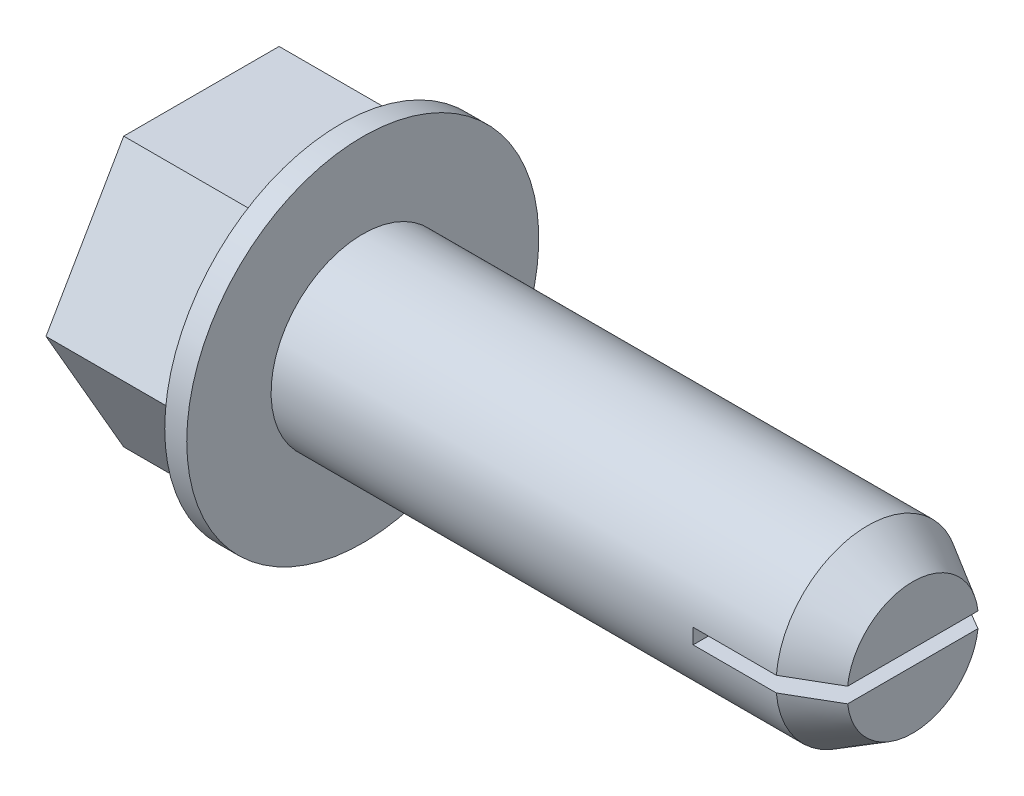
ISO-10303-21;
HEADER;
FILE_DESCRIPTION(('STEP AP214'),'2;1');
FILE_NAME('part.step','',(''),(''),'','','');
FILE_SCHEMA(('AUTOMOTIVE_DESIGN { 1 0 10303 214 1 1 1 1 }'));
ENDSEC;
DATA;
#1=APPLICATION_CONTEXT('core data for automotive mechanical design processes');
#2=APPLICATION_PROTOCOL_DEFINITION('international standard','automotive_design',2000,#1);
#3=PRODUCT_CONTEXT('',#1,'mechanical');
#4=PRODUCT('Part','Part','',(#3));
#5=PRODUCT_RELATED_PRODUCT_CATEGORY('part','',(#4));
#6=PRODUCT_DEFINITION_FORMATION('','',#4);
#7=PRODUCT_DEFINITION_CONTEXT('part definition',#1,'design');
#8=PRODUCT_DEFINITION('design','',#6,#7);
#9=PRODUCT_DEFINITION_SHAPE('','',#8);
#10=(LENGTH_UNIT() NAMED_UNIT(*) SI_UNIT(.MILLI.,.METRE.));
#11=(NAMED_UNIT(*) PLANE_ANGLE_UNIT() SI_UNIT($,.RADIAN.));
#12=(NAMED_UNIT(*) SI_UNIT($,.STERADIAN.) SOLID_ANGLE_UNIT());
#13=UNCERTAINTY_MEASURE_WITH_UNIT(LENGTH_MEASURE(1.E-05),#10,'distance_accuracy_value','');
#14=(GEOMETRIC_REPRESENTATION_CONTEXT(3) GLOBAL_UNCERTAINTY_ASSIGNED_CONTEXT((#13)) GLOBAL_UNIT_ASSIGNED_CONTEXT((#10,
#11,#12)) REPRESENTATION_CONTEXT('',''));
#15=CARTESIAN_POINT('',(0.,0.,0.));
#16=DIRECTION('',(0.,0.,1.));
#17=DIRECTION('',(1.,0.,0.));
#18=AXIS2_PLACEMENT_3D('',#15,#16,#17);
#19=CARTESIAN_POINT('',(-0.762,0.,0.));
#20=DIRECTION('',(1.,0.,0.));
#21=DIRECTION('',(0.,0.,-1.));
#22=AXIS2_PLACEMENT_3D('',#19,#20,#21);
#23=PLANE('',#22);
#24=CARTESIAN_POINT('',(-0.762,0.,0.));
#25=DIRECTION('',(-1.,0.,0.));
#26=DIRECTION('',(0.,0.,-1.));
#27=AXIS2_PLACEMENT_3D('',#24,#25,#26);
#28=CIRCLE('',#27,6.096);
#29=CARTESIAN_POINT('',(-0.762,0.,6.096));
#30=VERTEX_POINT('',#29);
#31=EDGE_CURVE('E184',#30,#30,#28,.T.);
#32=ORIENTED_EDGE('',*,*,#31,.T.);
#33=EDGE_LOOP('',(#32));
#34=FACE_BOUND('',#33,.T.);
#35=DIRECTION('',(0.,0.,1.));
#36=VECTOR('',#35,1.);
#37=CARTESIAN_POINT('',(-0.762,-4.6609,2.69097186966593));
#38=LINE('',#37,#36);
#39=CARTESIAN_POINT('',(-0.762,-4.6609,-2.69097186966593));
#40=VERTEX_POINT('',#39);
#41=CARTESIAN_POINT('',(-0.762,-4.6609,2.69097186966593));
#42=VERTEX_POINT('',#41);
#43=EDGE_CURVE('E151',#40,#42,#38,.T.);
#44=ORIENTED_EDGE('',*,*,#43,.F.);
#45=DIRECTION('',(0.,-0.866025403784439,0.5));
#46=VECTOR('',#45,1.);
#47=CARTESIAN_POINT('',(-0.762,-4.6609,-2.69097186966593));
#48=LINE('',#47,#46);
#49=CARTESIAN_POINT('',(-0.762,0.,-5.38194373933185));
#50=VERTEX_POINT('',#49);
#51=EDGE_CURVE('E148',#50,#40,#48,.T.);
#52=ORIENTED_EDGE('',*,*,#51,.F.);
#53=DIRECTION('',(0.,-0.866025403784439,-0.5));
#54=VECTOR('',#53,1.);
#55=CARTESIAN_POINT('',(-0.762,0.,-5.38194373933185));
#56=LINE('',#55,#54);
#57=CARTESIAN_POINT('',(-0.762,4.6609,-2.69097186966592));
#58=VERTEX_POINT('',#57);
#59=EDGE_CURVE('E447',#58,#50,#56,.T.);
#60=ORIENTED_EDGE('',*,*,#59,.F.);
#61=DIRECTION('',(0.,0.,-1.));
#62=VECTOR('',#61,1.);
#63=CARTESIAN_POINT('',(-0.762,4.6609,-2.69097186966592));
#64=LINE('',#63,#62);
#65=CARTESIAN_POINT('',(-0.762,4.6609,2.69097186966593));
#66=VERTEX_POINT('',#65);
#67=EDGE_CURVE('E430',#66,#58,#64,.T.);
#68=ORIENTED_EDGE('',*,*,#67,.F.);
#69=DIRECTION('',(0.,0.866025403784439,-0.5));
#70=VECTOR('',#69,1.);
#71=CARTESIAN_POINT('',(-0.762,4.6609,2.69097186966593));
#72=LINE('',#71,#70);
#73=CARTESIAN_POINT('',(-0.762,0.,5.38194373933185));
#74=VERTEX_POINT('',#73);
#75=EDGE_CURVE('E427',#74,#66,#72,.T.);
#76=ORIENTED_EDGE('',*,*,#75,.F.);
#77=DIRECTION('',(0.,0.866025403784439,0.5));
#78=VECTOR('',#77,1.);
#79=CARTESIAN_POINT('',(-0.762,0.,5.38194373933185));
#80=LINE('',#79,#78);
#81=EDGE_CURVE('E431',#42,#74,#80,.T.);
#82=ORIENTED_EDGE('',*,*,#81,.F.);
#83=EDGE_LOOP('',(#44,#52,#60,#68,#76,#82));
#84=FACE_BOUND('',#83,.T.);
#85=ADVANCED_FACE('F33',(#34,#84),#23,.F.);
#86=CARTESIAN_POINT('',(14.605,0.,0.));
#87=DIRECTION('',(1.,0.,0.));
#88=DIRECTION('',(0.,0.,-1.));
#89=AXIS2_PLACEMENT_3D('',#86,#87,#88);
#90=PLANE('',#89);
#91=CARTESIAN_POINT('',(14.605,0.,0.));
#92=DIRECTION('',(1.,0.,0.));
#93=DIRECTION('',(0.,0.,-1.));
#94=AXIS2_PLACEMENT_3D('',#91,#92,#93);
#95=CIRCLE('',#94,3.175);
#96=CARTESIAN_POINT('',(14.605,-0.264583333333333,-3.16395648827891));
#97=VERTEX_POINT('',#96);
#98=CARTESIAN_POINT('',(14.605,0.264583333333333,-3.16395648827891));
#99=VERTEX_POINT('',#98);
#100=EDGE_CURVE('E168',#97,#99,#95,.T.);
#101=ORIENTED_EDGE('',*,*,#100,.T.);
#102=DIRECTION('',(0.,0.,-1.));
#103=VECTOR('',#102,1.);
#104=CARTESIAN_POINT('',(14.605,0.264583333333333,-3.16395648827891));
#105=LINE('',#104,#103);
#106=CARTESIAN_POINT('',(14.605,0.264583333333333,3.16395648827891));
#107=VERTEX_POINT('',#106);
#108=EDGE_CURVE('E152',#107,#99,#105,.T.);
#109=ORIENTED_EDGE('',*,*,#108,.F.);
#110=CARTESIAN_POINT('',(14.605,-0.264583333333333,3.16395648827891));
#111=VERTEX_POINT('',#110);
#112=EDGE_CURVE('E172',#107,#111,#95,.T.);
#113=ORIENTED_EDGE('',*,*,#112,.T.);
#114=DIRECTION('',(0.,0.,-1.));
#115=VECTOR('',#114,1.);
#116=CARTESIAN_POINT('',(14.605,-0.264583333333333,3.16395648827891));
#117=LINE('',#116,#115);
#118=EDGE_CURVE('E171',#111,#97,#117,.T.);
#119=ORIENTED_EDGE('',*,*,#118,.T.);
#120=EDGE_LOOP('',(#101,#109,#113,#119));
#121=FACE_BOUND('',#120,.T.);
#122=ADVANCED_FACE('F216',(#121),#90,.T.);
#123=CARTESIAN_POINT('',(0.,0.,0.));
#124=DIRECTION('',(-1.,0.,0.));
#125=DIRECTION('',(0.,0.,1.));
#126=AXIS2_PLACEMENT_3D('',#123,#124,#125);
#127=CYLINDRICAL_SURFACE('',#126,6.096);
#128=CARTESIAN_POINT('',(0.,0.,0.));
#129=DIRECTION('',(-1.,0.,0.));
#130=DIRECTION('',(0.,0.,-1.));
#131=AXIS2_PLACEMENT_3D('',#128,#129,#130);
#132=CIRCLE('',#131,6.096);
#133=CARTESIAN_POINT('',(0.,0.,6.096));
#134=VERTEX_POINT('',#133);
#135=EDGE_CURVE('E185',#134,#134,#132,.T.);
#136=CARTESIAN_POINT('',(0.,0.,6.096));
#137=CARTESIAN_POINT('',(-0.00793749999999989,0.,6.096));
#138=CARTESIAN_POINT('',(-0.0158749999999999,0.,6.096));
#139=CARTESIAN_POINT('',(-0.0317499999999999,0.,6.096));
#140=CARTESIAN_POINT('',(-0.0396874999999999,0.,6.096));
#141=CARTESIAN_POINT('',(-0.0555624999999999,0.,6.096));
#142=CARTESIAN_POINT('',(-0.0634999999999999,0.,6.096));
#143=CARTESIAN_POINT('',(-0.0793749999999999,0.,6.096));
#144=CARTESIAN_POINT('',(-0.0873124999999999,0.,6.096));
#145=CARTESIAN_POINT('',(-0.1031875,0.,6.096));
#146=CARTESIAN_POINT('',(-0.111125,0.,6.096));
#147=CARTESIAN_POINT('',(-0.127,0.,6.096));
#148=CARTESIAN_POINT('',(-0.1349375,0.,6.096));
#149=CARTESIAN_POINT('',(-0.1508125,0.,6.096));
#150=CARTESIAN_POINT('',(-0.15875,0.,6.096));
#151=CARTESIAN_POINT('',(-0.174625,0.,6.096));
#152=CARTESIAN_POINT('',(-0.1825625,0.,6.096));
#153=CARTESIAN_POINT('',(-0.1984375,0.,6.096));
#154=CARTESIAN_POINT('',(-0.206375,0.,6.096));
#155=CARTESIAN_POINT('',(-0.22225,0.,6.096));
#156=CARTESIAN_POINT('',(-0.2301875,0.,6.096));
#157=CARTESIAN_POINT('',(-0.2460625,0.,6.096));
#158=CARTESIAN_POINT('',(-0.254,0.,6.096));
#159=CARTESIAN_POINT('',(-0.269875,0.,6.096));
#160=CARTESIAN_POINT('',(-0.2778125,0.,6.096));
#161=CARTESIAN_POINT('',(-0.2936875,0.,6.096));
#162=CARTESIAN_POINT('',(-0.301625,0.,6.096));
#163=CARTESIAN_POINT('',(-0.3175,0.,6.096));
#164=CARTESIAN_POINT('',(-0.3254375,0.,6.096));
#165=CARTESIAN_POINT('',(-0.3413125,0.,6.096));
#166=CARTESIAN_POINT('',(-0.34925,0.,6.096));
#167=CARTESIAN_POINT('',(-0.365125,0.,6.096));
#168=CARTESIAN_POINT('',(-0.3730625,0.,6.096));
#169=CARTESIAN_POINT('',(-0.3889375,0.,6.096));
#170=CARTESIAN_POINT('',(-0.396875,0.,6.096));
#171=CARTESIAN_POINT('',(-0.41275,0.,6.096));
#172=CARTESIAN_POINT('',(-0.4206875,0.,6.096));
#173=CARTESIAN_POINT('',(-0.4365625,0.,6.096));
#174=CARTESIAN_POINT('',(-0.4445,0.,6.096));
#175=CARTESIAN_POINT('',(-0.460375,0.,6.096));
#176=CARTESIAN_POINT('',(-0.4683125,0.,6.096));
#177=CARTESIAN_POINT('',(-0.4841875,0.,6.096));
#178=CARTESIAN_POINT('',(-0.492125,0.,6.096));
#179=CARTESIAN_POINT('',(-0.508,0.,6.096));
#180=CARTESIAN_POINT('',(-0.5159375,0.,6.096));
#181=CARTESIAN_POINT('',(-0.5318125,0.,6.096));
#182=CARTESIAN_POINT('',(-0.53975,0.,6.096));
#183=CARTESIAN_POINT('',(-0.555625,0.,6.096));
#184=CARTESIAN_POINT('',(-0.5635625,0.,6.096));
#185=CARTESIAN_POINT('',(-0.5794375,0.,6.096));
#186=CARTESIAN_POINT('',(-0.587375,0.,6.096));
#187=CARTESIAN_POINT('',(-0.60325,0.,6.096));
#188=CARTESIAN_POINT('',(-0.6111875,0.,6.096));
#189=CARTESIAN_POINT('',(-0.6270625,0.,6.096));
#190=CARTESIAN_POINT('',(-0.635,0.,6.096));
#191=CARTESIAN_POINT('',(-0.650875,0.,6.096));
#192=CARTESIAN_POINT('',(-0.6588125,0.,6.096));
#193=CARTESIAN_POINT('',(-0.6746875,0.,6.096));
#194=CARTESIAN_POINT('',(-0.682625,0.,6.096));
#195=CARTESIAN_POINT('',(-0.6985,0.,6.096));
#196=CARTESIAN_POINT('',(-0.7064375,0.,6.096));
#197=CARTESIAN_POINT('',(-0.7223125,0.,6.096));
#198=CARTESIAN_POINT('',(-0.73025,0.,6.096));
#199=CARTESIAN_POINT('',(-0.746125,0.,6.096));
#200=CARTESIAN_POINT('',(-0.7540625,0.,6.096));
#201=CARTESIAN_POINT('',(-0.762,0.,6.096));
#202=B_SPLINE_CURVE_WITH_KNOTS('',3,(#136,#137,#138,#139,#140,#141,#142,#143,#144,#145,#146,
#147,#148,#149,#150,#151,#152,#153,#154,#155,#156,#157,#158,#159,#160,#161,#162,#163,#164,#165,
#166,#167,#168,#169,#170,#171,#172,#173,#174,#175,#176,#177,#178,#179,#180,#181,#182,#183,#184,
#185,#186,#187,#188,#189,#190,#191,#192,#193,#194,#195,#196,#197,#198,#199,#200,#201),
.UNSPECIFIED.,.F.,.F.,(4,2,2,2,2,2,2,2,2,2,2,2,2,2,2,2,2,2,2,2,2,2,2,2,2,2,2,2,2,2,2,2,4),(0.,
0.0238125,0.047625,0.0714375,0.09525,0.1190625,0.142875,0.1666875,0.1905,0.2143125,0.238125,
0.2619375,0.28575,0.3095625,0.333375,0.3571875,0.381,0.4048125,0.428625,0.4524375,0.47625,
0.5000625,0.523875,0.5476875,0.5715,0.5953125,0.619125,0.6429375,0.66675,0.6905625,0.714375,
0.7381875,0.762),.UNSPECIFIED.);
#203=EDGE_CURVE('BSEAM219',#134,#30,#202,.T.);
#204=ORIENTED_EDGE('',*,*,#135,.T.);
#205=ORIENTED_EDGE('',*,*,#31,.F.);
#206=ORIENTED_EDGE('',*,*,#203,.T.);
#207=ORIENTED_EDGE('',*,*,#203,.F.);
#208=EDGE_LOOP('',(#204,#206,#205,#207));
#209=FACE_BOUND('',#208,.T.);
#210=ADVANCED_FACE('F219',(#209),#127,.T.);
#211=CARTESIAN_POINT('',(0.,0.,0.));
#212=DIRECTION('',(1.,0.,0.));
#213=DIRECTION('',(0.,0.,-1.));
#214=AXIS2_PLACEMENT_3D('',#211,#212,#213);
#215=PLANE('',#214);
#216=CARTESIAN_POINT('',(0.,0.,0.));
#217=DIRECTION('',(1.,0.,0.));
#218=DIRECTION('',(0.,0.,-1.));
#219=AXIS2_PLACEMENT_3D('',#216,#217,#218);
#220=CIRCLE('',#219,3.175);
#221=CARTESIAN_POINT('',(0.,0.,-3.175));
#222=VERTEX_POINT('',#221);
#223=EDGE_CURVE('E180',#222,#222,#220,.T.);
#224=ORIENTED_EDGE('',*,*,#223,.F.);
#225=EDGE_LOOP('',(#224));
#226=FACE_BOUND('',#225,.T.);
#227=ORIENTED_EDGE('',*,*,#135,.F.);
#228=EDGE_LOOP('',(#227));
#229=FACE_BOUND('',#228,.T.);
#230=ADVANCED_FACE('F260',(#226,#229),#215,.T.);
#231=CARTESIAN_POINT('',(19.05,0.,0.));
#232=DIRECTION('',(-1.,0.,0.));
#233=DIRECTION('',(0.,0.,1.));
#234=AXIS2_PLACEMENT_3D('',#231,#232,#233);
#235=CYLINDRICAL_SURFACE('',#234,3.175);
#236=DIRECTION('',(-1.,0.,0.));
#237=VECTOR('',#236,1.);
#238=CARTESIAN_POINT('',(19.05,0.264583333333333,3.16395648827891));
#239=LINE('',#238,#237);
#240=CARTESIAN_POINT('',(17.4882097868374,0.264583333333333,3.16395648827891));
#241=VERTEX_POINT('',#240);
#242=EDGE_CURVE('E165',#241,#107,#239,.T.);
#243=ORIENTED_EDGE('',*,*,#242,.F.);
#244=CARTESIAN_POINT('',(17.4882097868374,0.,0.));
#245=DIRECTION('',(-1.,0.,0.));
#246=DIRECTION('',(0.,0.,1.));
#247=AXIS2_PLACEMENT_3D('',#244,#245,#246);
#248=CIRCLE('',#247,3.175);
#249=CARTESIAN_POINT('',(17.4882097868374,0.264583333333333,-3.16395648827891));
#250=VERTEX_POINT('',#249);
#251=EDGE_CURVE('E233',#241,#250,#248,.T.);
#252=ORIENTED_EDGE('',*,*,#251,.T.);
#253=DIRECTION('',(-1.,0.,0.));
#254=VECTOR('',#253,1.);
#255=CARTESIAN_POINT('',(19.05,0.264583333333333,-3.16395648827891));
#256=LINE('',#255,#254);
#257=EDGE_CURVE('E162',#250,#99,#256,.T.);
#258=ORIENTED_EDGE('',*,*,#257,.T.);
#259=ORIENTED_EDGE('',*,*,#100,.F.);
#260=DIRECTION('',(1.,0.,0.));
#261=VECTOR('',#260,1.);
#262=CARTESIAN_POINT('',(14.605,-0.264583333333333,-3.16395648827891));
#263=LINE('',#262,#261);
#264=CARTESIAN_POINT('',(17.4882097868374,-0.264583333333333,-3.16395648827891));
#265=VERTEX_POINT('',#264);
#266=EDGE_CURVE('E177',#97,#265,#263,.T.);
#267=ORIENTED_EDGE('',*,*,#266,.T.);
#268=CARTESIAN_POINT('',(17.4882097868374,0.,0.));
#269=DIRECTION('',(1.,0.,0.));
#270=DIRECTION('',(0.,0.,-1.));
#271=AXIS2_PLACEMENT_3D('',#268,#269,#270);
#272=CIRCLE('',#271,3.175);
#273=CARTESIAN_POINT('',(17.4882097868374,-0.264583333333333,3.16395648827891));
#274=VERTEX_POINT('',#273);
#275=EDGE_CURVE('E234',#265,#274,#272,.F.);
#276=ORIENTED_EDGE('',*,*,#275,.T.);
#277=DIRECTION('',(1.,0.,0.));
#278=VECTOR('',#277,1.);
#279=CARTESIAN_POINT('',(14.605,-0.264583333333333,3.16395648827891));
#280=LINE('',#279,#278);
#281=EDGE_CURVE('E175',#111,#274,#280,.T.);
#282=ORIENTED_EDGE('',*,*,#281,.F.);
#283=ORIENTED_EDGE('',*,*,#112,.F.);
#284=EDGE_LOOP('',(#243,#252,#258,#259,#267,#276,#282,#283));
#285=FACE_BOUND('',#284,.T.);
#286=ORIENTED_EDGE('',*,*,#223,.T.);
#287=EDGE_LOOP('',(#286));
#288=FACE_BOUND('',#287,.T.);
#289=ADVANCED_FACE('F244',(#285,#288),#235,.T.);
#290=CARTESIAN_POINT('',(19.05,0.,0.));
#291=DIRECTION('',(1.,0.,0.));
#292=DIRECTION('',(0.,0.,-1.));
#293=AXIS2_PLACEMENT_3D('',#290,#291,#292);
#294=PLANE('',#293);
#295=DIRECTION('',(0.,0.,-1.));
#296=VECTOR('',#295,1.);
#297=CARTESIAN_POINT('',(19.05,-0.264583333333333,3.16395648827891));
#298=LINE('',#297,#296);
#299=CARTESIAN_POINT('',(19.05,-0.264583333333333,2.25785042678681));
#300=VERTEX_POINT('',#299);
#301=CARTESIAN_POINT('',(19.05,-0.264583333333333,-2.25785042678681));
#302=VERTEX_POINT('',#301);
#303=EDGE_CURVE('E167',#300,#302,#298,.T.);
#304=ORIENTED_EDGE('',*,*,#303,.F.);
#305=CARTESIAN_POINT('',(19.05,0.,0.));
#306=DIRECTION('',(1.,0.,0.));
#307=DIRECTION('',(0.,0.,-1.));
#308=AXIS2_PLACEMENT_3D('',#305,#306,#307);
#309=CIRCLE('',#308,2.27330000000421);
#310=EDGE_CURVE('E231',#300,#302,#309,.T.);
#311=ORIENTED_EDGE('',*,*,#310,.T.);
#312=EDGE_LOOP('',(#304,#311));
#313=FACE_BOUND('',#312,.T.);
#314=ADVANCED_FACE('F224',(#313),#294,.T.);
#315=CARTESIAN_POINT('',(14.605,-0.264583333333333,3.16395648827891));
#316=DIRECTION('',(0.,-1.,0.));
#317=DIRECTION('',(0.,0.,-1.));
#318=AXIS2_PLACEMENT_3D('',#315,#316,#317);
#319=PLANE('',#318);
#320=ORIENTED_EDGE('',*,*,#303,.T.);
#321=CARTESIAN_POINT('',(19.05,-0.264583333333333,-2.25785042678681));
#322=CARTESIAN_POINT('',(18.9199136361942,-0.264583333333333,-2.33346750791042));
#323=CARTESIAN_POINT('',(18.7898067189653,-0.264583333333333,-2.40904920794246));
#324=CARTESIAN_POINT('',(18.5295590617443,-0.264583333333333,-2.56015431967211));
#325=CARTESIAN_POINT('',(18.3994183217566,-0.264583333333333,-2.63567773137704));
#326=CARTESIAN_POINT('',(18.0089562455132,-0.264583333333333,-2.86217927280469));
#327=CARTESIAN_POINT('',(17.7485950521503,-0.264583333333333,-3.01308870932084));
#328=CARTESIAN_POINT('',(17.4882097868374,-0.264583333333333,-3.16395648827891));
#329=B_SPLINE_CURVE_WITH_KNOTS('',3,(#321,#322,#323,#324,#325,#326,#327,#328),.UNSPECIFIED.,.F.,
.F.,(4,2,2,4),(0.,0.451401842557992,0.902803628343581,1.80560719704494),.UNSPECIFIED.);
#330=EDGE_CURVE('E11',#302,#265,#329,.T.);
#331=ORIENTED_EDGE('',*,*,#330,.T.);
#332=ORIENTED_EDGE('',*,*,#266,.F.);
#333=ORIENTED_EDGE('',*,*,#118,.F.);
#334=ORIENTED_EDGE('',*,*,#281,.T.);
#335=CARTESIAN_POINT('',(17.4882097868374,-0.264583333333333,3.16395648827891));
#336=CARTESIAN_POINT('',(17.7485950521503,-0.264583333333333,3.01308870932084));
#337=CARTESIAN_POINT('',(18.0089562455132,-0.264583333333333,2.86217927280469));
#338=CARTESIAN_POINT('',(18.3994183217566,-0.264583333333333,2.63567773137704));
#339=CARTESIAN_POINT('',(18.5295590617443,-0.264583333333333,2.56015431967211));
#340=CARTESIAN_POINT('',(18.7898067189653,-0.264583333333333,2.40904920794246));
#341=CARTESIAN_POINT('',(18.9199136361942,-0.264583333333333,2.33346750791042));
#342=CARTESIAN_POINT('',(19.05,-0.264583333333333,2.25785042678681));
#343=B_SPLINE_CURVE_WITH_KNOTS('',3,(#335,#336,#337,#338,#339,#340,#341,#342),.UNSPECIFIED.,.F.,
.F.,(4,2,2,4),(0.,0.902803568701357,1.35420535448695,1.80560719704494),.UNSPECIFIED.);
#344=EDGE_CURVE('E46',#274,#300,#343,.T.);
#345=ORIENTED_EDGE('',*,*,#344,.T.);
#346=EDGE_LOOP('',(#320,#331,#332,#333,#334,#345));
#347=FACE_BOUND('',#346,.T.);
#348=ADVANCED_FACE('F213',(#347),#319,.F.);
#349=CARTESIAN_POINT('',(19.05,0.264583333333333,-3.16395648827891));
#350=DIRECTION('',(0.,1.,0.));
#351=DIRECTION('',(0.,0.,1.));
#352=AXIS2_PLACEMENT_3D('',#349,#350,#351);
#353=PLANE('',#352);
#354=DIRECTION('',(0.,0.,-1.));
#355=VECTOR('',#354,1.);
#356=CARTESIAN_POINT('',(19.05,0.264583333333333,-3.16395648827891));
#357=LINE('',#356,#355);
#358=CARTESIAN_POINT('',(19.05,0.264583333333333,2.25785042678681));
#359=VERTEX_POINT('',#358);
#360=CARTESIAN_POINT('',(19.05,0.264583333333333,-2.25785042678681));
#361=VERTEX_POINT('',#360);
#362=EDGE_CURVE('E155',#359,#361,#357,.T.);
#363=ORIENTED_EDGE('',*,*,#362,.F.);
#364=CARTESIAN_POINT('',(19.05,0.264583333333333,2.25785042678681));
#365=CARTESIAN_POINT('',(18.9199136361942,0.264583333333333,2.33346750791042));
#366=CARTESIAN_POINT('',(18.7898067189653,0.264583333333333,2.40904920794246));
#367=CARTESIAN_POINT('',(18.5295590617443,0.264583333333333,2.56015431967211));
#368=CARTESIAN_POINT('',(18.3994183217566,0.264583333333333,2.63567773137704));
#369=CARTESIAN_POINT('',(18.0089562455132,0.264583333333333,2.86217927280469));
#370=CARTESIAN_POINT('',(17.7485950521503,0.264583333333333,3.01308870932084));
#371=CARTESIAN_POINT('',(17.4882097868374,0.264583333333333,3.16395648827891));
#372=B_SPLINE_CURVE_WITH_KNOTS('',3,(#364,#365,#366,#367,#368,#369,#370,#371),.UNSPECIFIED.,.F.,
.F.,(4,2,2,4),(0.,0.451401842557992,0.902803628343581,1.80560719704494),.UNSPECIFIED.);
#373=EDGE_CURVE('E199',#359,#241,#372,.T.);
#374=ORIENTED_EDGE('',*,*,#373,.T.);
#375=ORIENTED_EDGE('',*,*,#242,.T.);
#376=ORIENTED_EDGE('',*,*,#108,.T.);
#377=ORIENTED_EDGE('',*,*,#257,.F.);
#378=CARTESIAN_POINT('',(17.4882097868374,0.264583333333333,-3.16395648827891));
#379=CARTESIAN_POINT('',(17.7485950521503,0.264583333333333,-3.01308870932084));
#380=CARTESIAN_POINT('',(18.0089562455132,0.264583333333333,-2.86217927280469));
#381=CARTESIAN_POINT('',(18.3994183217566,0.264583333333333,-2.63567773137704));
#382=CARTESIAN_POINT('',(18.5295590617443,0.264583333333333,-2.56015431967211));
#383=CARTESIAN_POINT('',(18.7898067189653,0.264583333333333,-2.40904920794246));
#384=CARTESIAN_POINT('',(18.9199136361942,0.264583333333333,-2.33346750791042));
#385=CARTESIAN_POINT('',(19.05,0.264583333333333,-2.25785042678681));
#386=B_SPLINE_CURVE_WITH_KNOTS('',3,(#378,#379,#380,#381,#382,#383,#384,#385),.UNSPECIFIED.,.F.,
.F.,(4,2,2,4),(0.,0.902803568701357,1.35420535448695,1.80560719704494),.UNSPECIFIED.);
#387=EDGE_CURVE('E193',#250,#361,#386,.T.);
#388=ORIENTED_EDGE('',*,*,#387,.T.);
#389=EDGE_LOOP('',(#363,#374,#375,#376,#377,#388));
#390=FACE_BOUND('',#389,.T.);
#391=ADVANCED_FACE('F207',(#390),#353,.F.);
#392=CARTESIAN_POINT('',(19.05,0.,0.));
#393=DIRECTION('',(-1.,0.,0.));
#394=DIRECTION('',(0.,0.,1.));
#395=AXIS2_PLACEMENT_3D('',#392,#393,#394);
#396=PLANE('',#395);
#397=ORIENTED_EDGE('',*,*,#362,.T.);
#398=CARTESIAN_POINT('',(19.05,0.,0.));
#399=DIRECTION('',(-1.,0.,0.));
#400=DIRECTION('',(0.,0.,1.));
#401=AXIS2_PLACEMENT_3D('',#398,#399,#400);
#402=CIRCLE('',#401,2.27330000000421);
#403=EDGE_CURVE('E188',#361,#359,#402,.F.);
#404=ORIENTED_EDGE('',*,*,#403,.T.);
#405=EDGE_LOOP('',(#397,#404));
#406=FACE_BOUND('',#405,.T.);
#407=ADVANCED_FACE('F212',(#406),#396,.F.);
#408=CARTESIAN_POINT('',(-5.588,-4.6609,2.69097186966593));
#409=DIRECTION('',(0.,1.,0.));
#410=DIRECTION('',(0.,0.,1.));
#411=AXIS2_PLACEMENT_3D('',#408,#409,#410);
#412=PLANE('',#411);
#413=ORIENTED_EDGE('',*,*,#43,.T.);
#414=DIRECTION('',(1.,0.,0.));
#415=VECTOR('',#414,1.);
#416=CARTESIAN_POINT('',(-5.588,-4.6609,2.69097186966593));
#417=LINE('',#416,#415);
#418=CARTESIAN_POINT('',(-5.588,-4.6609,2.69097186966593));
#419=VERTEX_POINT('',#418);
#420=EDGE_CURVE('E132',#419,#42,#417,.T.);
#421=ORIENTED_EDGE('',*,*,#420,.F.);
#422=DIRECTION('',(0.,0.,1.));
#423=VECTOR('',#422,1.);
#424=CARTESIAN_POINT('',(-5.588,-4.6609,2.69097186966593));
#425=LINE('',#424,#423);
#426=CARTESIAN_POINT('',(-5.588,-4.6609,-2.69097186966593));
#427=VERTEX_POINT('',#426);
#428=EDGE_CURVE('E139',#427,#419,#425,.T.);
#429=ORIENTED_EDGE('',*,*,#428,.F.);
#430=DIRECTION('',(1.,0.,0.));
#431=VECTOR('',#430,1.);
#432=CARTESIAN_POINT('',(-5.588,-4.6609,-2.69097186966593));
#433=LINE('',#432,#431);
#434=EDGE_CURVE('E443',#427,#40,#433,.T.);
#435=ORIENTED_EDGE('',*,*,#434,.T.);
#436=EDGE_LOOP('',(#413,#421,#429,#435));
#437=FACE_BOUND('',#436,.T.);
#438=ADVANCED_FACE('F150',(#437),#412,.F.);
#439=CARTESIAN_POINT('',(-5.588,0.,5.38194373933185));
#440=DIRECTION('',(0.,0.5,-0.866025403784439));
#441=DIRECTION('',(0.,0.866025403784439,0.5));
#442=AXIS2_PLACEMENT_3D('',#439,#440,#441);
#443=PLANE('',#442);
#444=ORIENTED_EDGE('',*,*,#81,.T.);
#445=DIRECTION('',(1.,0.,0.));
#446=VECTOR('',#445,1.);
#447=CARTESIAN_POINT('',(-5.588,0.,5.38194373933185));
#448=LINE('',#447,#446);
#449=CARTESIAN_POINT('',(-5.588,0.,5.38194373933185));
#450=VERTEX_POINT('',#449);
#451=EDGE_CURVE('E135',#450,#74,#448,.T.);
#452=ORIENTED_EDGE('',*,*,#451,.F.);
#453=DIRECTION('',(0.,0.866025403784439,0.5));
#454=VECTOR('',#453,1.);
#455=CARTESIAN_POINT('',(-5.588,0.,5.38194373933185));
#456=LINE('',#455,#454);
#457=EDGE_CURVE('E127',#419,#450,#456,.T.);
#458=ORIENTED_EDGE('',*,*,#457,.F.);
#459=ORIENTED_EDGE('',*,*,#420,.T.);
#460=EDGE_LOOP('',(#444,#452,#458,#459));
#461=FACE_BOUND('',#460,.T.);
#462=ADVANCED_FACE('F130',(#461),#443,.F.);
#463=CARTESIAN_POINT('',(-5.588,4.6609,2.69097186966593));
#464=DIRECTION('',(0.,-0.5,-0.866025403784439));
#465=DIRECTION('',(0.,0.866025403784439,-0.5));
#466=AXIS2_PLACEMENT_3D('',#463,#464,#465);
#467=PLANE('',#466);
#468=ORIENTED_EDGE('',*,*,#75,.T.);
#469=DIRECTION('',(1.,0.,0.));
#470=VECTOR('',#469,1.);
#471=CARTESIAN_POINT('',(-5.588,4.6609,2.69097186966593));
#472=LINE('',#471,#470);
#473=CARTESIAN_POINT('',(-5.588,4.6609,2.69097186966593));
#474=VERTEX_POINT('',#473);
#475=EDGE_CURVE('E157',#474,#66,#472,.T.);
#476=ORIENTED_EDGE('',*,*,#475,.F.);
#477=DIRECTION('',(0.,0.866025403784439,-0.5));
#478=VECTOR('',#477,1.);
#479=CARTESIAN_POINT('',(-5.588,4.6609,2.69097186966593));
#480=LINE('',#479,#478);
#481=EDGE_CURVE('E138',#450,#474,#480,.T.);
#482=ORIENTED_EDGE('',*,*,#481,.F.);
#483=ORIENTED_EDGE('',*,*,#451,.T.);
#484=EDGE_LOOP('',(#468,#476,#482,#483));
#485=FACE_BOUND('',#484,.T.);
#486=ADVANCED_FACE('F314',(#485),#467,.F.);
#487=CARTESIAN_POINT('',(-5.588,4.6609,-2.69097186966592));
#488=DIRECTION('',(0.,-1.,0.));
#489=DIRECTION('',(0.,0.,-1.));
#490=AXIS2_PLACEMENT_3D('',#487,#488,#489);
#491=PLANE('',#490);
#492=ORIENTED_EDGE('',*,*,#67,.T.);
#493=DIRECTION('',(1.,0.,0.));
#494=VECTOR('',#493,1.);
#495=CARTESIAN_POINT('',(-5.588,4.6609,-2.69097186966592));
#496=LINE('',#495,#494);
#497=CARTESIAN_POINT('',(-5.588,4.6609,-2.69097186966592));
#498=VERTEX_POINT('',#497);
#499=EDGE_CURVE('E437',#498,#58,#496,.T.);
#500=ORIENTED_EDGE('',*,*,#499,.F.);
#501=DIRECTION('',(0.,0.,-1.));
#502=VECTOR('',#501,1.);
#503=CARTESIAN_POINT('',(-5.588,4.6609,-2.69097186966592));
#504=LINE('',#503,#502);
#505=EDGE_CURVE('E436',#474,#498,#504,.T.);
#506=ORIENTED_EDGE('',*,*,#505,.F.);
#507=ORIENTED_EDGE('',*,*,#475,.T.);
#508=EDGE_LOOP('',(#492,#500,#506,#507));
#509=FACE_BOUND('',#508,.T.);
#510=ADVANCED_FACE('F310',(#509),#491,.F.);
#511=CARTESIAN_POINT('',(-5.588,0.,-5.38194373933185));
#512=DIRECTION('',(0.,-0.5,0.866025403784439));
#513=DIRECTION('',(0.,-0.866025403784439,-0.5));
#514=AXIS2_PLACEMENT_3D('',#511,#512,#513);
#515=PLANE('',#514);
#516=ORIENTED_EDGE('',*,*,#59,.T.);
#517=DIRECTION('',(1.,0.,0.));
#518=VECTOR('',#517,1.);
#519=CARTESIAN_POINT('',(-5.588,0.,-5.38194373933185));
#520=LINE('',#519,#518);
#521=CARTESIAN_POINT('',(-5.588,0.,-5.38194373933185));
#522=VERTEX_POINT('',#521);
#523=EDGE_CURVE('E438',#522,#50,#520,.T.);
#524=ORIENTED_EDGE('',*,*,#523,.F.);
#525=DIRECTION('',(0.,-0.866025403784439,-0.5));
#526=VECTOR('',#525,1.);
#527=CARTESIAN_POINT('',(-5.588,0.,-5.38194373933185));
#528=LINE('',#527,#526);
#529=EDGE_CURVE('E455',#498,#522,#528,.T.);
#530=ORIENTED_EDGE('',*,*,#529,.F.);
#531=ORIENTED_EDGE('',*,*,#499,.T.);
#532=EDGE_LOOP('',(#516,#524,#530,#531));
#533=FACE_BOUND('',#532,.T.);
#534=ADVANCED_FACE('F306',(#533),#515,.F.);
#535=CARTESIAN_POINT('',(-5.588,-4.6609,-2.69097186966593));
#536=DIRECTION('',(0.,0.5,0.866025403784439));
#537=DIRECTION('',(0.,-0.866025403784439,0.5));
#538=AXIS2_PLACEMENT_3D('',#535,#536,#537);
#539=PLANE('',#538);
#540=ORIENTED_EDGE('',*,*,#51,.T.);
#541=ORIENTED_EDGE('',*,*,#434,.F.);
#542=DIRECTION('',(0.,-0.866025403784439,0.5));
#543=VECTOR('',#542,1.);
#544=CARTESIAN_POINT('',(-5.588,-4.6609,-2.69097186966593));
#545=LINE('',#544,#543);
#546=EDGE_CURVE('E144',#522,#427,#545,.T.);
#547=ORIENTED_EDGE('',*,*,#546,.F.);
#548=ORIENTED_EDGE('',*,*,#523,.T.);
#549=EDGE_LOOP('',(#540,#541,#547,#548));
#550=FACE_BOUND('',#549,.T.);
#551=ADVANCED_FACE('F302',(#550),#539,.F.);
#552=CARTESIAN_POINT('',(-5.588,0.,0.));
#553=DIRECTION('',(1.,0.,0.));
#554=DIRECTION('',(0.,0.,-1.));
#555=AXIS2_PLACEMENT_3D('',#552,#553,#554);
#556=PLANE('',#555);
#557=CARTESIAN_POINT('',(-5.588,4.25938424711709E-12,2.70507230582059E-11));
#558=DIRECTION('',(-1.,0.,-4.84085953075596E-12));
#559=DIRECTION('',(-4.84085953075596E-12,0.,1.));
#560=AXIS2_PLACEMENT_3D('',#557,#558,#559);
#561=CIRCLE('',#560,3.72872000000001);
#562=CARTESIAN_POINT('',(-5.58800000001805,4.25938424711709E-12,3.72872000002706));
#563=VERTEX_POINT('',#562);
#564=EDGE_CURVE('E461',#563,#563,#561,.T.);
#565=ORIENTED_EDGE('',*,*,#564,.F.);
#566=EDGE_LOOP('',(#565));
#567=FACE_BOUND('',#566,.T.);
#568=ORIENTED_EDGE('',*,*,#428,.T.);
#569=ORIENTED_EDGE('',*,*,#457,.T.);
#570=ORIENTED_EDGE('',*,*,#481,.T.);
#571=ORIENTED_EDGE('',*,*,#505,.T.);
#572=ORIENTED_EDGE('',*,*,#529,.T.);
#573=ORIENTED_EDGE('',*,*,#546,.T.);
#574=EDGE_LOOP('',(#568,#569,#570,#571,#572,#573));
#575=FACE_BOUND('',#574,.T.);
#576=ADVANCED_FACE('F142',(#567,#575),#556,.F.);
#577=CARTESIAN_POINT('',(-4.6228,4.25938424711709E-12,3.17231206772915E-11));
#578=DIRECTION('',(1.,0.,4.84085953075596E-12));
#579=DIRECTION('',(4.84085953075596E-12,0.,-1.));
#580=AXIS2_PLACEMENT_3D('',#577,#578,#579);
#581=PLANE('',#580);
#582=CARTESIAN_POINT('',(-4.6228,4.25938424711709E-12,3.17231206772915E-11));
#583=DIRECTION('',(-1.,0.,-4.84085953075596E-12));
#584=DIRECTION('',(-4.84085953075596E-12,0.,1.));
#585=AXIS2_PLACEMENT_3D('',#582,#583,#584);
#586=CIRCLE('',#585,3.72872000000001);
#587=CARTESIAN_POINT('',(-4.62280000001805,4.25938424711709E-12,3.72872000003174));
#588=VERTEX_POINT('',#587);
#589=EDGE_CURVE('E453',#588,#588,#586,.T.);
#590=ORIENTED_EDGE('',*,*,#589,.T.);
#591=EDGE_LOOP('',(#590));
#592=FACE_BOUND('',#591,.T.);
#593=ADVANCED_FACE('F289',(#592),#581,.F.);
#594=CARTESIAN_POINT('',(-5.588,4.25938424711709E-12,2.70507230582059E-11));
#595=DIRECTION('',(-1.,0.,-4.84085953075596E-12));
#596=DIRECTION('',(-4.84085953075596E-12,0.,1.));
#597=AXIS2_PLACEMENT_3D('',#594,#595,#596);
#598=CYLINDRICAL_SURFACE('',#597,3.72872000000001);
#599=ORIENTED_EDGE('',*,*,#589,.F.);
#600=EDGE_LOOP('',(#599));
#601=FACE_BOUND('',#600,.T.);
#602=ORIENTED_EDGE('',*,*,#564,.T.);
#603=EDGE_LOOP('',(#602));
#604=FACE_BOUND('',#603,.T.);
#605=ADVANCED_FACE('F285',(#601,#604),#598,.F.);
#606=CARTESIAN_POINT('',(19.05,0.,0.));
#607=DIRECTION('',(-1.,0.,0.));
#608=DIRECTION('',(0.,0.,1.));
#609=AXIS2_PLACEMENT_3D('',#606,#607,#608);
#610=CONICAL_SURFACE('',#609,2.27330000000421,0.523598775602452);
#611=ORIENTED_EDGE('',*,*,#387,.F.);
#612=ORIENTED_EDGE('',*,*,#251,.F.);
#613=ORIENTED_EDGE('',*,*,#373,.F.);
#614=ORIENTED_EDGE('',*,*,#403,.F.);
#615=EDGE_LOOP('',(#611,#612,#613,#614));
#616=FACE_BOUND('',#615,.T.);
#617=ADVANCED_FACE('F204',(#616),#610,.T.);
#618=CARTESIAN_POINT('',(19.05,0.,0.));
#619=DIRECTION('',(-1.,0.,0.));
#620=DIRECTION('',(0.,0.,1.));
#621=AXIS2_PLACEMENT_3D('',#618,#619,#620);
#622=CONICAL_SURFACE('',#621,2.27330000000421,0.523598775602452);
#623=ORIENTED_EDGE('',*,*,#344,.F.);
#624=ORIENTED_EDGE('',*,*,#275,.F.);
#625=ORIENTED_EDGE('',*,*,#330,.F.);
#626=ORIENTED_EDGE('',*,*,#310,.F.);
#627=EDGE_LOOP('',(#623,#624,#625,#626));
#628=FACE_BOUND('',#627,.T.);
#629=ADVANCED_FACE('F35',(#628),#622,.T.);
#630=CLOSED_SHELL('',(#85,#122,#210,#230,#289,#314,#348,#391,#407,#438,#462,#486,#510,#534,#551,
#576,#593,#605,#617,#629));
#631=MANIFOLD_SOLID_BREP('B2',#630);
#632=ADVANCED_BREP_SHAPE_REPRESENTATION('',(#18,#631),#14);
#633=SHAPE_DEFINITION_REPRESENTATION(#9,#632);
ENDSEC;
END-ISO-10303-21;
